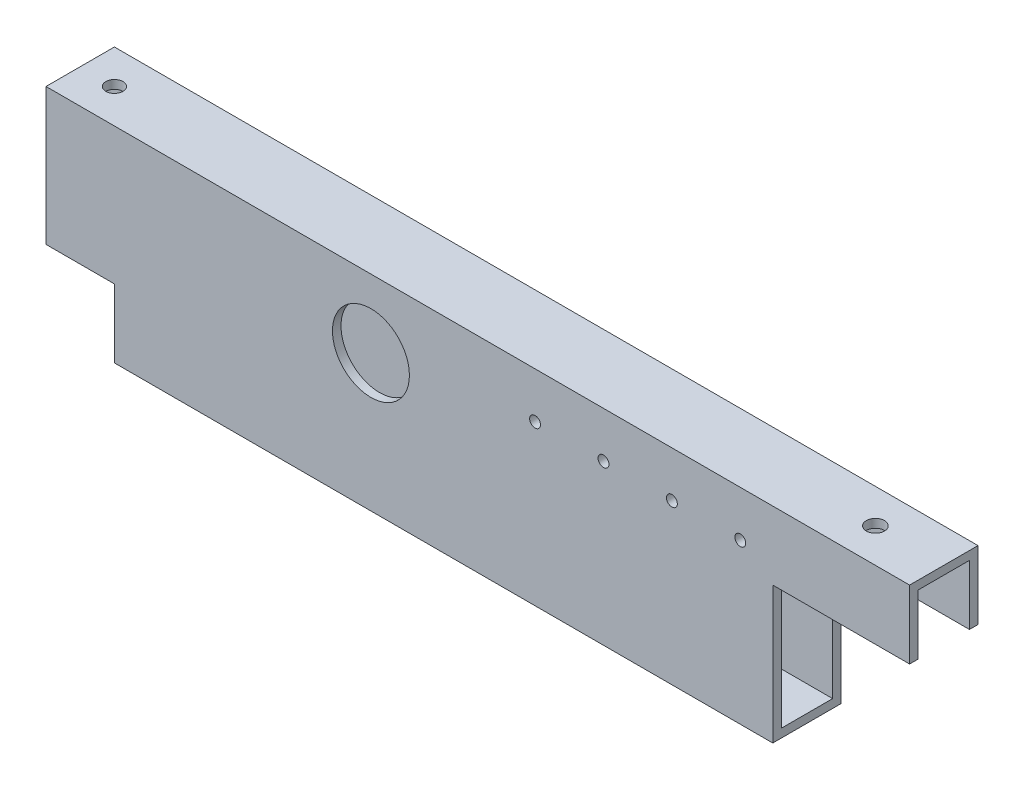
ISO-10303-21;
HEADER;
FILE_DESCRIPTION(('STEP AP214'),'2;1');
FILE_NAME('part.step','',(''),(''),'','','');
FILE_SCHEMA(('AUTOMOTIVE_DESIGN { 1 0 10303 214 1 1 1 1 }'));
ENDSEC;
DATA;
#1=APPLICATION_CONTEXT('core data for automotive mechanical design processes');
#2=APPLICATION_PROTOCOL_DEFINITION('international standard','automotive_design',2000,#1);
#3=PRODUCT_CONTEXT('',#1,'mechanical');
#4=PRODUCT('Part','Part','',(#3));
#5=PRODUCT_RELATED_PRODUCT_CATEGORY('part','',(#4));
#6=PRODUCT_DEFINITION_FORMATION('','',#4);
#7=PRODUCT_DEFINITION_CONTEXT('part definition',#1,'design');
#8=PRODUCT_DEFINITION('design','',#6,#7);
#9=PRODUCT_DEFINITION_SHAPE('','',#8);
#10=(LENGTH_UNIT() NAMED_UNIT(*) SI_UNIT(.MILLI.,.METRE.));
#11=(NAMED_UNIT(*) PLANE_ANGLE_UNIT() SI_UNIT($,.RADIAN.));
#12=(NAMED_UNIT(*) SI_UNIT($,.STERADIAN.) SOLID_ANGLE_UNIT());
#13=UNCERTAINTY_MEASURE_WITH_UNIT(LENGTH_MEASURE(1.E-05),#10,'distance_accuracy_value','');
#14=(GEOMETRIC_REPRESENTATION_CONTEXT(3) GLOBAL_UNCERTAINTY_ASSIGNED_CONTEXT((#13)) GLOBAL_UNIT_ASSIGNED_CONTEXT((#10,
#11,#12)) REPRESENTATION_CONTEXT('',''));
#15=CARTESIAN_POINT('',(0.,0.,0.));
#16=DIRECTION('',(0.,0.,1.));
#17=DIRECTION('',(1.,0.,0.));
#18=AXIS2_PLACEMENT_3D('',#15,#16,#17);
#19=CARTESIAN_POINT('',(0.,-12.7000000000001,12.7));
#20=DIRECTION('',(0.,1.,0.));
#21=DIRECTION('',(0.,0.,1.));
#22=AXIS2_PLACEMENT_3D('',#19,#20,#21);
#23=PLANE('',#22);
#24=DIRECTION('',(0.,0.,-1.));
#25=VECTOR('',#24,1.);
#26=CARTESIAN_POINT('',(-288.925,-12.7000000000001,12.7));
#27=LINE('',#26,#25);
#28=CARTESIAN_POINT('',(-288.925,-12.7000000000001,12.7));
#29=VERTEX_POINT('',#28);
#30=CARTESIAN_POINT('',(-288.925,-12.7,9.525));
#31=VERTEX_POINT('',#30);
#32=EDGE_CURVE('E293',#29,#31,#27,.T.);
#33=ORIENTED_EDGE('',*,*,#32,.T.);
#34=DIRECTION('',(1.,0.,0.));
#35=VECTOR('',#34,1.);
#36=CARTESIAN_POINT('',(0.,-12.7000000000001,9.525));
#37=LINE('',#36,#35);
#38=CARTESIAN_POINT('',(-263.525,-12.7000000000001,9.525));
#39=VERTEX_POINT('',#38);
#40=EDGE_CURVE('E255',#31,#39,#37,.T.);
#41=ORIENTED_EDGE('',*,*,#40,.T.);
#42=DIRECTION('',(0.,0.,-1.));
#43=VECTOR('',#42,1.);
#44=CARTESIAN_POINT('',(-263.525,-12.7000000000001,12.7));
#45=LINE('',#44,#43);
#46=CARTESIAN_POINT('',(-263.525,-12.7000000000001,12.7));
#47=VERTEX_POINT('',#46);
#48=EDGE_CURVE('E289',#47,#39,#45,.T.);
#49=ORIENTED_EDGE('',*,*,#48,.F.);
#50=DIRECTION('',(1.,0.,0.));
#51=VECTOR('',#50,1.);
#52=CARTESIAN_POINT('',(0.,-12.7000000000001,12.7));
#53=LINE('',#52,#51);
#54=EDGE_CURVE('E268',#29,#47,#53,.T.);
#55=ORIENTED_EDGE('',*,*,#54,.F.);
#56=EDGE_LOOP('',(#33,#41,#49,#55));
#57=FACE_BOUND('',#56,.T.);
#58=ADVANCED_FACE('F36',(#57),#23,.F.);
#59=CARTESIAN_POINT('',(0.,38.1,12.7));
#60=DIRECTION('',(0.,1.,0.));
#61=DIRECTION('',(0.,0.,1.));
#62=AXIS2_PLACEMENT_3D('',#59,#60,#61);
#63=PLANE('',#62);
#64=CARTESIAN_POINT('',(6.34999999999977,38.1,0.));
#65=DIRECTION('',(0.,1.,0.));
#66=DIRECTION('',(0.,0.,1.));
#67=AXIS2_PLACEMENT_3D('',#64,#65,#66);
#68=CIRCLE('',#67,3.3782);
#69=CARTESIAN_POINT('',(6.34999999999977,38.1,3.3782));
#70=VERTEX_POINT('',#69);
#71=EDGE_CURVE('E622',#70,#70,#68,.T.);
#72=ORIENTED_EDGE('',*,*,#71,.F.);
#73=EDGE_LOOP('',(#72));
#74=FACE_BOUND('',#73,.T.);
#75=DIRECTION('',(0.,0.,1.));
#76=VECTOR('',#75,1.);
#77=CARTESIAN_POINT('',(31.7499999999998,38.1,-12.7));
#78=LINE('',#77,#76);
#79=CARTESIAN_POINT('',(31.7499999999998,38.1,-12.7));
#80=VERTEX_POINT('',#79);
#81=CARTESIAN_POINT('',(31.7499999999998,38.1,12.7));
#82=VERTEX_POINT('',#81);
#83=EDGE_CURVE('E195',#80,#82,#78,.T.);
#84=ORIENTED_EDGE('',*,*,#83,.F.);
#85=DIRECTION('',(1.,0.,0.));
#86=VECTOR('',#85,1.);
#87=CARTESIAN_POINT('',(0.,38.1,-12.7));
#88=LINE('',#87,#86);
#89=CARTESIAN_POINT('',(-288.925,38.1,-12.7));
#90=VERTEX_POINT('',#89);
#91=EDGE_CURVE('E261',#90,#80,#88,.T.);
#92=ORIENTED_EDGE('',*,*,#91,.F.);
#93=DIRECTION('',(0.,0.,-1.));
#94=VECTOR('',#93,1.);
#95=CARTESIAN_POINT('',(-288.925,38.1,12.7));
#96=LINE('',#95,#94);
#97=CARTESIAN_POINT('',(-288.925,38.1,12.7));
#98=VERTEX_POINT('',#97);
#99=EDGE_CURVE('E296',#98,#90,#96,.T.);
#100=ORIENTED_EDGE('',*,*,#99,.F.);
#101=DIRECTION('',(1.,0.,0.));
#102=VECTOR('',#101,1.);
#103=CARTESIAN_POINT('',(0.,38.1,12.7));
#104=LINE('',#103,#102);
#105=EDGE_CURVE('E262',#98,#82,#104,.T.);
#106=ORIENTED_EDGE('',*,*,#105,.T.);
#107=EDGE_LOOP('',(#84,#92,#100,#106));
#108=FACE_BOUND('',#107,.T.);
#109=CARTESIAN_POINT('',(-276.225,38.1,0.));
#110=DIRECTION('',(0.,1.,0.));
#111=DIRECTION('',(0.,0.,1.));
#112=AXIS2_PLACEMENT_3D('',#109,#110,#111);
#113=CIRCLE('',#112,3.17499999999998);
#114=CARTESIAN_POINT('',(-276.225,38.1,3.17499999999998));
#115=VERTEX_POINT('',#114);
#116=EDGE_CURVE('E258',#115,#115,#113,.T.);
#117=ORIENTED_EDGE('',*,*,#116,.F.);
#118=EDGE_LOOP('',(#117));
#119=FACE_BOUND('',#118,.T.);
#120=ADVANCED_FACE('F38',(#74,#108,#119),#63,.T.);
#121=CARTESIAN_POINT('',(-288.925,0.,12.7));
#122=DIRECTION('',(1.,0.,0.));
#123=DIRECTION('',(0.,0.,-1.));
#124=AXIS2_PLACEMENT_3D('',#121,#122,#123);
#125=PLANE('',#124);
#126=DIRECTION('',(0.,0.,1.));
#127=VECTOR('',#126,1.);
#128=CARTESIAN_POINT('',(-288.925,34.925,-9.525));
#129=LINE('',#128,#127);
#130=CARTESIAN_POINT('',(-288.925,34.925,-9.525));
#131=VERTEX_POINT('',#130);
#132=CARTESIAN_POINT('',(-288.925,34.925,9.525));
#133=VERTEX_POINT('',#132);
#134=EDGE_CURVE('E233',#131,#133,#129,.T.);
#135=ORIENTED_EDGE('',*,*,#134,.T.);
#136=DIRECTION('',(0.,-1.,0.));
#137=VECTOR('',#136,1.);
#138=CARTESIAN_POINT('',(-288.925,34.925,9.525));
#139=LINE('',#138,#137);
#140=EDGE_CURVE('E236',#133,#31,#139,.T.);
#141=ORIENTED_EDGE('',*,*,#140,.T.);
#142=ORIENTED_EDGE('',*,*,#32,.F.);
#143=DIRECTION('',(0.,-1.,0.));
#144=VECTOR('',#143,1.);
#145=CARTESIAN_POINT('',(-288.925,0.,12.7));
#146=LINE('',#145,#144);
#147=EDGE_CURVE('E265',#98,#29,#146,.T.);
#148=ORIENTED_EDGE('',*,*,#147,.F.);
#149=ORIENTED_EDGE('',*,*,#99,.T.);
#150=DIRECTION('',(0.,-1.,0.));
#151=VECTOR('',#150,1.);
#152=CARTESIAN_POINT('',(-288.925,0.,-12.7));
#153=LINE('',#152,#151);
#154=CARTESIAN_POINT('',(-288.925,-12.7000000000001,-12.7));
#155=VERTEX_POINT('',#154);
#156=EDGE_CURVE('E277',#90,#155,#153,.T.);
#157=ORIENTED_EDGE('',*,*,#156,.T.);
#158=CARTESIAN_POINT('',(-288.925,-12.7000000000001,-9.525));
#159=VERTEX_POINT('',#158);
#160=EDGE_CURVE('E292',#159,#155,#27,.T.);
#161=ORIENTED_EDGE('',*,*,#160,.F.);
#162=DIRECTION('',(0.,1.,0.));
#163=VECTOR('',#162,1.);
#164=CARTESIAN_POINT('',(-288.925,-34.925,-9.525));
#165=LINE('',#164,#163);
#166=EDGE_CURVE('E230',#159,#131,#165,.T.);
#167=ORIENTED_EDGE('',*,*,#166,.T.);
#168=EDGE_LOOP('',(#135,#141,#142,#148,#149,#157,#161,#167));
#169=FACE_BOUND('',#168,.T.);
#170=ADVANCED_FACE('F344',(#169),#125,.F.);
#171=CARTESIAN_POINT('',(-263.525,-12.7000000000001,-9.525));
#172=VERTEX_POINT('',#171);
#173=CARTESIAN_POINT('',(-263.525,-12.7000000000001,-12.7));
#174=VERTEX_POINT('',#173);
#175=EDGE_CURVE('E288',#172,#174,#45,.T.);
#176=ORIENTED_EDGE('',*,*,#175,.F.);
#177=DIRECTION('',(-1.,0.,0.));
#178=VECTOR('',#177,1.);
#179=CARTESIAN_POINT('',(0.,-12.7000000000001,-9.525));
#180=LINE('',#179,#178);
#181=EDGE_CURVE('E252',#172,#159,#180,.T.);
#182=ORIENTED_EDGE('',*,*,#181,.T.);
#183=ORIENTED_EDGE('',*,*,#160,.T.);
#184=DIRECTION('',(1.,0.,0.));
#185=VECTOR('',#184,1.);
#186=CARTESIAN_POINT('',(0.,-12.7000000000001,-12.7));
#187=LINE('',#186,#185);
#188=EDGE_CURVE('E280',#155,#174,#187,.T.);
#189=ORIENTED_EDGE('',*,*,#188,.T.);
#190=EDGE_LOOP('',(#176,#182,#183,#189));
#191=FACE_BOUND('',#190,.T.);
#192=ADVANCED_FACE('F349',(#191),#23,.F.);
#193=CARTESIAN_POINT('',(-263.525,0.,12.7));
#194=DIRECTION('',(1.,0.,0.));
#195=DIRECTION('',(0.,0.,-1.));
#196=AXIS2_PLACEMENT_3D('',#193,#194,#195);
#197=PLANE('',#196);
#198=ORIENTED_EDGE('',*,*,#48,.T.);
#199=DIRECTION('',(0.,-1.,0.));
#200=VECTOR('',#199,1.);
#201=CARTESIAN_POINT('',(-263.525,0.,9.525));
#202=LINE('',#201,#200);
#203=CARTESIAN_POINT('',(-263.525,-34.925,9.525));
#204=VERTEX_POINT('',#203);
#205=EDGE_CURVE('E306',#39,#204,#202,.T.);
#206=ORIENTED_EDGE('',*,*,#205,.T.);
#207=DIRECTION('',(0.,0.,-1.));
#208=VECTOR('',#207,1.);
#209=CARTESIAN_POINT('',(-263.525,-34.925,12.7));
#210=LINE('',#209,#208);
#211=CARTESIAN_POINT('',(-263.525,-34.925,-9.525));
#212=VERTEX_POINT('',#211);
#213=EDGE_CURVE('E303',#204,#212,#210,.T.);
#214=ORIENTED_EDGE('',*,*,#213,.T.);
#215=DIRECTION('',(0.,1.,0.));
#216=VECTOR('',#215,1.);
#217=CARTESIAN_POINT('',(-263.525,0.,-9.525));
#218=LINE('',#217,#216);
#219=EDGE_CURVE('E298',#212,#172,#218,.T.);
#220=ORIENTED_EDGE('',*,*,#219,.T.);
#221=ORIENTED_EDGE('',*,*,#175,.T.);
#222=DIRECTION('',(0.,-1.,0.));
#223=VECTOR('',#222,1.);
#224=CARTESIAN_POINT('',(-263.525,0.,-12.7));
#225=LINE('',#224,#223);
#226=CARTESIAN_POINT('',(-263.525,-38.1000000000001,-12.7));
#227=VERTEX_POINT('',#226);
#228=EDGE_CURVE('E283',#174,#227,#225,.T.);
#229=ORIENTED_EDGE('',*,*,#228,.T.);
#230=DIRECTION('',(0.,0.,-1.));
#231=VECTOR('',#230,1.);
#232=CARTESIAN_POINT('',(-263.525,-38.1000000000001,12.7));
#233=LINE('',#232,#231);
#234=CARTESIAN_POINT('',(-263.525,-38.1000000000001,12.7));
#235=VERTEX_POINT('',#234);
#236=EDGE_CURVE('E275',#235,#227,#233,.T.);
#237=ORIENTED_EDGE('',*,*,#236,.F.);
#238=DIRECTION('',(0.,-1.,0.));
#239=VECTOR('',#238,1.);
#240=CARTESIAN_POINT('',(-263.525,0.,12.7));
#241=LINE('',#240,#239);
#242=EDGE_CURVE('E270',#47,#235,#241,.T.);
#243=ORIENTED_EDGE('',*,*,#242,.F.);
#244=EDGE_LOOP('',(#198,#206,#214,#220,#221,#229,#237,#243));
#245=FACE_BOUND('',#244,.T.);
#246=ADVANCED_FACE('F336',(#245),#197,.F.);
#247=CARTESIAN_POINT('',(0.,-38.1,12.7));
#248=DIRECTION('',(0.,1.,0.));
#249=DIRECTION('',(-1.,0.,0.));
#250=AXIS2_PLACEMENT_3D('',#247,#248,#249);
#251=PLANE('',#250);
#252=DIRECTION('',(1.,0.,0.));
#253=VECTOR('',#252,1.);
#254=CARTESIAN_POINT('',(0.,-38.1,-12.7));
#255=LINE('',#254,#253);
#256=CARTESIAN_POINT('',(-19.0500000000002,-38.1000000000001,-12.7));
#257=VERTEX_POINT('',#256);
#258=EDGE_CURVE('E266',#227,#257,#255,.T.);
#259=ORIENTED_EDGE('',*,*,#258,.T.);
#260=DIRECTION('',(0.,0.,1.));
#261=VECTOR('',#260,1.);
#262=CARTESIAN_POINT('',(-19.0500000000002,-38.1000000000001,-12.7));
#263=LINE('',#262,#261);
#264=CARTESIAN_POINT('',(-19.0500000000002,-38.1000000000001,12.7));
#265=VERTEX_POINT('',#264);
#266=EDGE_CURVE('E155',#257,#265,#263,.T.);
#267=ORIENTED_EDGE('',*,*,#266,.T.);
#268=DIRECTION('',(1.,0.,0.));
#269=VECTOR('',#268,1.);
#270=CARTESIAN_POINT('',(0.,-38.1,12.7));
#271=LINE('',#270,#269);
#272=EDGE_CURVE('E272',#235,#265,#271,.T.);
#273=ORIENTED_EDGE('',*,*,#272,.F.);
#274=ORIENTED_EDGE('',*,*,#236,.T.);
#275=EDGE_LOOP('',(#259,#267,#273,#274));
#276=FACE_BOUND('',#275,.T.);
#277=ADVANCED_FACE('F354',(#276),#251,.F.);
#278=CARTESIAN_POINT('',(0.,0.,12.7));
#279=DIRECTION('',(0.,0.,1.));
#280=DIRECTION('',(1.,0.,0.));
#281=AXIS2_PLACEMENT_3D('',#278,#279,#280);
#282=PLANE('',#281);
#283=DIRECTION('',(0.,-1.,0.));
#284=VECTOR('',#283,1.);
#285=CARTESIAN_POINT('',(-19.0500000000002,-38.1000000000001,12.7));
#286=LINE('',#285,#284);
#287=CARTESIAN_POINT('',(-19.0500000000002,12.6999999999999,12.7));
#288=VERTEX_POINT('',#287);
#289=EDGE_CURVE('E171',#288,#265,#286,.T.);
#290=ORIENTED_EDGE('',*,*,#289,.F.);
#291=DIRECTION('',(-1.,0.,0.));
#292=VECTOR('',#291,1.);
#293=CARTESIAN_POINT('',(31.7499999999998,12.7,12.7));
#294=LINE('',#293,#292);
#295=CARTESIAN_POINT('',(31.7499999999998,12.7,12.7));
#296=VERTEX_POINT('',#295);
#297=EDGE_CURVE('E173',#296,#288,#294,.T.);
#298=ORIENTED_EDGE('',*,*,#297,.F.);
#299=DIRECTION('',(0.,-1.,0.));
#300=VECTOR('',#299,1.);
#301=CARTESIAN_POINT('',(31.7499999999998,38.1,12.7));
#302=LINE('',#301,#300);
#303=EDGE_CURVE('E193',#82,#296,#302,.T.);
#304=ORIENTED_EDGE('',*,*,#303,.F.);
#305=ORIENTED_EDGE('',*,*,#105,.F.);
#306=ORIENTED_EDGE('',*,*,#147,.T.);
#307=ORIENTED_EDGE('',*,*,#54,.T.);
#308=ORIENTED_EDGE('',*,*,#242,.T.);
#309=ORIENTED_EDGE('',*,*,#272,.T.);
#310=EDGE_LOOP('',(#290,#298,#304,#305,#306,#307,#308,#309));
#311=FACE_BOUND('',#310,.T.);
#312=CARTESIAN_POINT('',(-107.315,21.082,12.7));
#313=DIRECTION('',(0.,0.,1.));
#314=DIRECTION('',(1.,0.,0.));
#315=AXIS2_PLACEMENT_3D('',#312,#313,#314);
#316=CIRCLE('',#315,2.01929999999999);
#317=CARTESIAN_POINT('',(-105.2957,21.082,12.7));
#318=VERTEX_POINT('',#317);
#319=EDGE_CURVE('E202',#318,#318,#316,.T.);
#320=ORIENTED_EDGE('',*,*,#319,.F.);
#321=EDGE_LOOP('',(#320));
#322=FACE_BOUND('',#321,.T.);
#323=CARTESIAN_POINT('',(-81.9150000000002,21.082,12.7));
#324=DIRECTION('',(0.,0.,1.));
#325=DIRECTION('',(1.,0.,0.));
#326=AXIS2_PLACEMENT_3D('',#323,#324,#325);
#327=CIRCLE('',#326,2.01929999999999);
#328=CARTESIAN_POINT('',(-79.8957000000002,21.082,12.7));
#329=VERTEX_POINT('',#328);
#330=EDGE_CURVE('E206',#329,#329,#327,.T.);
#331=ORIENTED_EDGE('',*,*,#330,.F.);
#332=EDGE_LOOP('',(#331));
#333=FACE_BOUND('',#332,.T.);
#334=CARTESIAN_POINT('',(-56.5150000000002,21.082,12.7));
#335=DIRECTION('',(0.,0.,1.));
#336=DIRECTION('',(1.,0.,0.));
#337=AXIS2_PLACEMENT_3D('',#334,#335,#336);
#338=CIRCLE('',#337,2.01929999999999);
#339=CARTESIAN_POINT('',(-54.4957000000002,21.082,12.7));
#340=VERTEX_POINT('',#339);
#341=EDGE_CURVE('E212',#340,#340,#338,.T.);
#342=ORIENTED_EDGE('',*,*,#341,.F.);
#343=EDGE_LOOP('',(#342));
#344=FACE_BOUND('',#343,.T.);
#345=CARTESIAN_POINT('',(-31.1150000000002,21.082,12.7));
#346=DIRECTION('',(0.,0.,1.));
#347=DIRECTION('',(1.,0.,0.));
#348=AXIS2_PLACEMENT_3D('',#345,#346,#347);
#349=CIRCLE('',#348,2.01929999999999);
#350=CARTESIAN_POINT('',(-29.0957000000003,21.082,12.7));
#351=VERTEX_POINT('',#350);
#352=EDGE_CURVE('E216',#351,#351,#349,.T.);
#353=ORIENTED_EDGE('',*,*,#352,.F.);
#354=EDGE_LOOP('',(#353));
#355=FACE_BOUND('',#354,.T.);
#356=CARTESIAN_POINT('',(-168.275,12.7,12.7));
#357=DIRECTION('',(0.,0.,1.));
#358=DIRECTION('',(1.,0.,0.));
#359=AXIS2_PLACEMENT_3D('',#356,#357,#358);
#360=CIRCLE('',#359,14.2875);
#361=CARTESIAN_POINT('',(-153.9875,12.7,12.7));
#362=VERTEX_POINT('',#361);
#363=EDGE_CURVE('E224',#362,#362,#360,.T.);
#364=ORIENTED_EDGE('',*,*,#363,.F.);
#365=EDGE_LOOP('',(#364));
#366=FACE_BOUND('',#365,.T.);
#367=ADVANCED_FACE('F357',(#311,#322,#333,#344,#355,#366),#282,.T.);
#368=CARTESIAN_POINT('',(0.,0.,-12.7));
#369=DIRECTION('',(0.,0.,1.));
#370=DIRECTION('',(1.,0.,0.));
#371=AXIS2_PLACEMENT_3D('',#368,#369,#370);
#372=PLANE('',#371);
#373=CARTESIAN_POINT('',(-168.275,12.7,-12.7));
#374=DIRECTION('',(0.,0.,1.));
#375=DIRECTION('',(1.,0.,0.));
#376=AXIS2_PLACEMENT_3D('',#373,#374,#375);
#377=CIRCLE('',#376,14.2875);
#378=CARTESIAN_POINT('',(-153.9875,12.7,-12.7));
#379=VERTEX_POINT('',#378);
#380=EDGE_CURVE('E220',#379,#379,#377,.T.);
#381=ORIENTED_EDGE('',*,*,#380,.T.);
#382=EDGE_LOOP('',(#381));
#383=FACE_BOUND('',#382,.T.);
#384=DIRECTION('',(-1.,0.,0.));
#385=VECTOR('',#384,1.);
#386=CARTESIAN_POINT('',(31.7499999999998,12.7,-12.7));
#387=LINE('',#386,#385);
#388=CARTESIAN_POINT('',(31.7499999999998,12.7,-12.7));
#389=VERTEX_POINT('',#388);
#390=CARTESIAN_POINT('',(-19.0500000000002,12.6999999999999,-12.7));
#391=VERTEX_POINT('',#390);
#392=EDGE_CURVE('E51',#389,#391,#387,.T.);
#393=ORIENTED_EDGE('',*,*,#392,.T.);
#394=DIRECTION('',(0.,-1.,0.));
#395=VECTOR('',#394,1.);
#396=CARTESIAN_POINT('',(-19.0500000000002,-38.1000000000001,-12.7));
#397=LINE('',#396,#395);
#398=EDGE_CURVE('E159',#391,#257,#397,.T.);
#399=ORIENTED_EDGE('',*,*,#398,.T.);
#400=ORIENTED_EDGE('',*,*,#258,.F.);
#401=ORIENTED_EDGE('',*,*,#228,.F.);
#402=ORIENTED_EDGE('',*,*,#188,.F.);
#403=ORIENTED_EDGE('',*,*,#156,.F.);
#404=ORIENTED_EDGE('',*,*,#91,.T.);
#405=DIRECTION('',(0.,-1.,0.));
#406=VECTOR('',#405,1.);
#407=CARTESIAN_POINT('',(31.7499999999998,38.1,-12.7));
#408=LINE('',#407,#406);
#409=EDGE_CURVE('E170',#80,#389,#408,.T.);
#410=ORIENTED_EDGE('',*,*,#409,.T.);
#411=EDGE_LOOP('',(#393,#399,#400,#401,#402,#403,#404,#410));
#412=FACE_BOUND('',#411,.T.);
#413=ADVANCED_FACE('F168',(#383,#412),#372,.F.);
#414=CARTESIAN_POINT('',(-276.225,38.1,0.));
#415=DIRECTION('',(0.,1.,0.));
#416=DIRECTION('',(0.,0.,1.));
#417=AXIS2_PLACEMENT_3D('',#414,#415,#416);
#418=CYLINDRICAL_SURFACE('',#417,3.17499999999998);
#419=CARTESIAN_POINT('',(-276.225,34.925,0.));
#420=DIRECTION('',(0.,1.,0.));
#421=DIRECTION('',(0.,0.,1.));
#422=AXIS2_PLACEMENT_3D('',#419,#420,#421);
#423=CIRCLE('',#422,3.17499999999998);
#424=CARTESIAN_POINT('',(-276.225,34.925,3.17499999999998));
#425=VERTEX_POINT('',#424);
#426=EDGE_CURVE('E243',#425,#425,#423,.F.);
#427=ORIENTED_EDGE('',*,*,#426,.T.);
#428=EDGE_LOOP('',(#427));
#429=FACE_BOUND('',#428,.T.);
#430=ORIENTED_EDGE('',*,*,#116,.T.);
#431=EDGE_LOOP('',(#430));
#432=FACE_BOUND('',#431,.T.);
#433=ADVANCED_FACE('F523',(#429,#432),#418,.F.);
#434=CARTESIAN_POINT('',(-288.925,-34.925,9.525));
#435=DIRECTION('',(0.,-1.,0.));
#436=DIRECTION('',(0.,0.,-1.));
#437=AXIS2_PLACEMENT_3D('',#434,#435,#436);
#438=PLANE('',#437);
#439=DIRECTION('',(1.,0.,0.));
#440=VECTOR('',#439,1.);
#441=CARTESIAN_POINT('',(-288.925,-34.925,9.525));
#442=LINE('',#441,#440);
#443=CARTESIAN_POINT('',(-19.0500000000002,-34.925,9.525));
#444=VERTEX_POINT('',#443);
#445=EDGE_CURVE('E244',#204,#444,#442,.T.);
#446=ORIENTED_EDGE('',*,*,#445,.T.);
#447=DIRECTION('',(0.,0.,-1.));
#448=VECTOR('',#447,1.);
#449=CARTESIAN_POINT('',(-19.0500000000002,-34.925,9.525));
#450=LINE('',#449,#448);
#451=CARTESIAN_POINT('',(-19.0500000000002,-34.925,-9.525));
#452=VERTEX_POINT('',#451);
#453=EDGE_CURVE('E187',#444,#452,#450,.T.);
#454=ORIENTED_EDGE('',*,*,#453,.T.);
#455=DIRECTION('',(1.,0.,0.));
#456=VECTOR('',#455,1.);
#457=CARTESIAN_POINT('',(-288.925,-34.925,-9.525));
#458=LINE('',#457,#456);
#459=EDGE_CURVE('E240',#212,#452,#458,.T.);
#460=ORIENTED_EDGE('',*,*,#459,.F.);
#461=ORIENTED_EDGE('',*,*,#213,.F.);
#462=EDGE_LOOP('',(#446,#454,#460,#461));
#463=FACE_BOUND('',#462,.T.);
#464=ADVANCED_FACE('F333',(#463),#438,.F.);
#465=CARTESIAN_POINT('',(-288.925,-12.7000000000001,9.525));
#466=DIRECTION('',(0.,0.,1.));
#467=DIRECTION('',(1.,0.,0.));
#468=AXIS2_PLACEMENT_3D('',#465,#466,#467);
#469=PLANE('',#468);
#470=CARTESIAN_POINT('',(-107.315,21.082,9.525));
#471=DIRECTION('',(0.,0.,1.));
#472=DIRECTION('',(1.,0.,0.));
#473=AXIS2_PLACEMENT_3D('',#470,#471,#472);
#474=CIRCLE('',#473,2.01929999999999);
#475=CARTESIAN_POINT('',(-105.2957,21.082,9.525));
#476=VERTEX_POINT('',#475);
#477=EDGE_CURVE('E205',#476,#476,#474,.T.);
#478=ORIENTED_EDGE('',*,*,#477,.T.);
#479=EDGE_LOOP('',(#478));
#480=FACE_BOUND('',#479,.T.);
#481=CARTESIAN_POINT('',(-81.9150000000002,21.082,9.525));
#482=DIRECTION('',(0.,0.,1.));
#483=DIRECTION('',(1.,0.,0.));
#484=AXIS2_PLACEMENT_3D('',#481,#482,#483);
#485=CIRCLE('',#484,2.01929999999999);
#486=CARTESIAN_POINT('',(-79.8957000000002,21.082,9.525));
#487=VERTEX_POINT('',#486);
#488=EDGE_CURVE('E209',#487,#487,#485,.T.);
#489=ORIENTED_EDGE('',*,*,#488,.T.);
#490=EDGE_LOOP('',(#489));
#491=FACE_BOUND('',#490,.T.);
#492=CARTESIAN_POINT('',(-56.5150000000002,21.082,9.525));
#493=DIRECTION('',(0.,0.,1.));
#494=DIRECTION('',(1.,0.,0.));
#495=AXIS2_PLACEMENT_3D('',#492,#493,#494);
#496=CIRCLE('',#495,2.01929999999999);
#497=CARTESIAN_POINT('',(-54.4957000000002,21.082,9.525));
#498=VERTEX_POINT('',#497);
#499=EDGE_CURVE('E215',#498,#498,#496,.T.);
#500=ORIENTED_EDGE('',*,*,#499,.T.);
#501=EDGE_LOOP('',(#500));
#502=FACE_BOUND('',#501,.T.);
#503=CARTESIAN_POINT('',(-31.1150000000002,21.082,9.525));
#504=DIRECTION('',(0.,0.,1.));
#505=DIRECTION('',(1.,0.,0.));
#506=AXIS2_PLACEMENT_3D('',#503,#504,#505);
#507=CIRCLE('',#506,2.01929999999999);
#508=CARTESIAN_POINT('',(-29.0957000000003,21.082,9.525));
#509=VERTEX_POINT('',#508);
#510=EDGE_CURVE('E219',#509,#509,#507,.T.);
#511=ORIENTED_EDGE('',*,*,#510,.T.);
#512=EDGE_LOOP('',(#511));
#513=FACE_BOUND('',#512,.T.);
#514=CARTESIAN_POINT('',(-168.275,12.7,9.525));
#515=DIRECTION('',(0.,0.,1.));
#516=DIRECTION('',(1.,0.,0.));
#517=AXIS2_PLACEMENT_3D('',#514,#515,#516);
#518=CIRCLE('',#517,14.2875);
#519=CARTESIAN_POINT('',(-153.9875,12.7,9.525));
#520=VERTEX_POINT('',#519);
#521=EDGE_CURVE('E227',#520,#520,#518,.T.);
#522=ORIENTED_EDGE('',*,*,#521,.T.);
#523=EDGE_LOOP('',(#522));
#524=FACE_BOUND('',#523,.T.);
#525=DIRECTION('',(-1.,0.,0.));
#526=VECTOR('',#525,1.);
#527=CARTESIAN_POINT('',(-288.925,12.6999999999999,9.525));
#528=LINE('',#527,#526);
#529=CARTESIAN_POINT('',(31.7499999999998,12.7,9.525));
#530=VERTEX_POINT('',#529);
#531=CARTESIAN_POINT('',(-19.0500000000002,12.6999999999999,9.525));
#532=VERTEX_POINT('',#531);
#533=EDGE_CURVE('E184',#530,#532,#528,.T.);
#534=ORIENTED_EDGE('',*,*,#533,.T.);
#535=DIRECTION('',(0.,-1.,0.));
#536=VECTOR('',#535,1.);
#537=CARTESIAN_POINT('',(-19.0500000000002,-12.7000000000001,9.525));
#538=LINE('',#537,#536);
#539=EDGE_CURVE('E190',#532,#444,#538,.T.);
#540=ORIENTED_EDGE('',*,*,#539,.T.);
#541=ORIENTED_EDGE('',*,*,#445,.F.);
#542=ORIENTED_EDGE('',*,*,#205,.F.);
#543=ORIENTED_EDGE('',*,*,#40,.F.);
#544=ORIENTED_EDGE('',*,*,#140,.F.);
#545=DIRECTION('',(1.,0.,0.));
#546=VECTOR('',#545,1.);
#547=CARTESIAN_POINT('',(-288.925,34.925,9.525));
#548=LINE('',#547,#546);
#549=CARTESIAN_POINT('',(31.7499999999998,34.925,9.525));
#550=VERTEX_POINT('',#549);
#551=EDGE_CURVE('E247',#133,#550,#548,.T.);
#552=ORIENTED_EDGE('',*,*,#551,.T.);
#553=DIRECTION('',(0.,-1.,0.));
#554=VECTOR('',#553,1.);
#555=CARTESIAN_POINT('',(31.7499999999998,-12.7000000000001,9.525));
#556=LINE('',#555,#554);
#557=EDGE_CURVE('E59',#550,#530,#556,.T.);
#558=ORIENTED_EDGE('',*,*,#557,.T.);
#559=EDGE_LOOP('',(#534,#540,#541,#542,#543,#544,#552,#558));
#560=FACE_BOUND('',#559,.T.);
#561=ADVANCED_FACE('F323',(#480,#491,#502,#513,#524,#560),#469,.F.);
#562=CARTESIAN_POINT('',(-288.925,-12.7000000000001,-9.525));
#563=DIRECTION('',(0.,0.,-1.));
#564=DIRECTION('',(-1.,0.,0.));
#565=AXIS2_PLACEMENT_3D('',#562,#563,#564);
#566=PLANE('',#565);
#567=CARTESIAN_POINT('',(-168.275,12.7,-9.525));
#568=DIRECTION('',(0.,0.,-1.));
#569=DIRECTION('',(-1.,0.,0.));
#570=AXIS2_PLACEMENT_3D('',#567,#568,#569);
#571=CIRCLE('',#570,14.2875);
#572=CARTESIAN_POINT('',(-182.5625,12.7,-9.525));
#573=VERTEX_POINT('',#572);
#574=EDGE_CURVE('E223',#573,#573,#571,.T.);
#575=ORIENTED_EDGE('',*,*,#574,.T.);
#576=EDGE_LOOP('',(#575));
#577=FACE_BOUND('',#576,.T.);
#578=ORIENTED_EDGE('',*,*,#459,.T.);
#579=DIRECTION('',(0.,1.,0.));
#580=VECTOR('',#579,1.);
#581=CARTESIAN_POINT('',(-19.0500000000002,-12.7000000000001,-9.525));
#582=LINE('',#581,#580);
#583=CARTESIAN_POINT('',(-19.0500000000002,12.6999999999999,-9.525));
#584=VERTEX_POINT('',#583);
#585=EDGE_CURVE('E11',#452,#584,#582,.T.);
#586=ORIENTED_EDGE('',*,*,#585,.T.);
#587=DIRECTION('',(1.,0.,0.));
#588=VECTOR('',#587,1.);
#589=CARTESIAN_POINT('',(-288.925,12.6999999999999,-9.525));
#590=LINE('',#589,#588);
#591=CARTESIAN_POINT('',(31.7499999999998,12.7,-9.525));
#592=VERTEX_POINT('',#591);
#593=EDGE_CURVE('E153',#584,#592,#590,.T.);
#594=ORIENTED_EDGE('',*,*,#593,.T.);
#595=DIRECTION('',(0.,1.,0.));
#596=VECTOR('',#595,1.);
#597=CARTESIAN_POINT('',(31.7499999999998,-12.7000000000001,-9.525));
#598=LINE('',#597,#596);
#599=CARTESIAN_POINT('',(31.7499999999998,34.925,-9.525));
#600=VERTEX_POINT('',#599);
#601=EDGE_CURVE('E199',#592,#600,#598,.T.);
#602=ORIENTED_EDGE('',*,*,#601,.T.);
#603=DIRECTION('',(1.,0.,0.));
#604=VECTOR('',#603,1.);
#605=CARTESIAN_POINT('',(-288.925,34.925,-9.525));
#606=LINE('',#605,#604);
#607=EDGE_CURVE('E239',#131,#600,#606,.T.);
#608=ORIENTED_EDGE('',*,*,#607,.F.);
#609=ORIENTED_EDGE('',*,*,#166,.F.);
#610=ORIENTED_EDGE('',*,*,#181,.F.);
#611=ORIENTED_EDGE('',*,*,#219,.F.);
#612=EDGE_LOOP('',(#578,#586,#594,#602,#608,#609,#610,#611));
#613=FACE_BOUND('',#612,.T.);
#614=ADVANCED_FACE('F330',(#577,#613),#566,.F.);
#615=CARTESIAN_POINT('',(-288.925,34.925,-9.525));
#616=DIRECTION('',(0.,1.,0.));
#617=DIRECTION('',(0.,0.,1.));
#618=AXIS2_PLACEMENT_3D('',#615,#616,#617);
#619=PLANE('',#618);
#620=CARTESIAN_POINT('',(6.34999999999977,34.925,0.));
#621=DIRECTION('',(0.,1.,0.));
#622=DIRECTION('',(0.,0.,1.));
#623=AXIS2_PLACEMENT_3D('',#620,#621,#622);
#624=CIRCLE('',#623,3.3782);
#625=CARTESIAN_POINT('',(6.34999999999977,34.925,3.3782));
#626=VERTEX_POINT('',#625);
#627=EDGE_CURVE('E176',#626,#626,#624,.T.);
#628=ORIENTED_EDGE('',*,*,#627,.T.);
#629=EDGE_LOOP('',(#628));
#630=FACE_BOUND('',#629,.T.);
#631=ORIENTED_EDGE('',*,*,#426,.F.);
#632=EDGE_LOOP('',(#631));
#633=FACE_BOUND('',#632,.T.);
#634=ORIENTED_EDGE('',*,*,#607,.T.);
#635=DIRECTION('',(0.,0.,1.));
#636=VECTOR('',#635,1.);
#637=CARTESIAN_POINT('',(31.7499999999998,34.925,-9.525));
#638=LINE('',#637,#636);
#639=EDGE_CURVE('E309',#600,#550,#638,.T.);
#640=ORIENTED_EDGE('',*,*,#639,.T.);
#641=ORIENTED_EDGE('',*,*,#551,.F.);
#642=ORIENTED_EDGE('',*,*,#134,.F.);
#643=EDGE_LOOP('',(#634,#640,#641,#642));
#644=FACE_BOUND('',#643,.T.);
#645=ADVANCED_FACE('F327',(#630,#633,#644),#619,.F.);
#646=CARTESIAN_POINT('',(-168.275,12.7,-12.7));
#647=DIRECTION('',(0.,0.,1.));
#648=DIRECTION('',(1.,0.,0.));
#649=AXIS2_PLACEMENT_3D('',#646,#647,#648);
#650=CYLINDRICAL_SURFACE('',#649,14.2875);
#651=ORIENTED_EDGE('',*,*,#380,.F.);
#652=EDGE_LOOP('',(#651));
#653=FACE_BOUND('',#652,.T.);
#654=ORIENTED_EDGE('',*,*,#574,.F.);
#655=EDGE_LOOP('',(#654));
#656=FACE_BOUND('',#655,.T.);
#657=ADVANCED_FACE('F405',(#653,#656),#650,.F.);
#658=ORIENTED_EDGE('',*,*,#363,.T.);
#659=EDGE_LOOP('',(#658));
#660=FACE_BOUND('',#659,.T.);
#661=ORIENTED_EDGE('',*,*,#521,.F.);
#662=EDGE_LOOP('',(#661));
#663=FACE_BOUND('',#662,.T.);
#664=ADVANCED_FACE('F477',(#660,#663),#650,.F.);
#665=CARTESIAN_POINT('',(-31.1150000000002,21.082,12.7));
#666=DIRECTION('',(0.,0.,1.));
#667=DIRECTION('',(1.,0.,0.));
#668=AXIS2_PLACEMENT_3D('',#665,#666,#667);
#669=CYLINDRICAL_SURFACE('',#668,2.01929999999999);
#670=ORIENTED_EDGE('',*,*,#352,.T.);
#671=EDGE_LOOP('',(#670));
#672=FACE_BOUND('',#671,.T.);
#673=ORIENTED_EDGE('',*,*,#510,.F.);
#674=EDGE_LOOP('',(#673));
#675=FACE_BOUND('',#674,.T.);
#676=ADVANCED_FACE('F467',(#672,#675),#669,.F.);
#677=CARTESIAN_POINT('',(-56.5150000000002,21.082,12.7));
#678=DIRECTION('',(0.,0.,1.));
#679=DIRECTION('',(1.,0.,0.));
#680=AXIS2_PLACEMENT_3D('',#677,#678,#679);
#681=CYLINDRICAL_SURFACE('',#680,2.01929999999999);
#682=ORIENTED_EDGE('',*,*,#341,.T.);
#683=EDGE_LOOP('',(#682));
#684=FACE_BOUND('',#683,.T.);
#685=ORIENTED_EDGE('',*,*,#499,.F.);
#686=EDGE_LOOP('',(#685));
#687=FACE_BOUND('',#686,.T.);
#688=ADVANCED_FACE('F457',(#684,#687),#681,.F.);
#689=CARTESIAN_POINT('',(-81.9150000000002,21.082,12.7));
#690=DIRECTION('',(0.,0.,1.));
#691=DIRECTION('',(1.,0.,0.));
#692=AXIS2_PLACEMENT_3D('',#689,#690,#691);
#693=CYLINDRICAL_SURFACE('',#692,2.01929999999999);
#694=ORIENTED_EDGE('',*,*,#330,.T.);
#695=EDGE_LOOP('',(#694));
#696=FACE_BOUND('',#695,.T.);
#697=ORIENTED_EDGE('',*,*,#488,.F.);
#698=EDGE_LOOP('',(#697));
#699=FACE_BOUND('',#698,.T.);
#700=ADVANCED_FACE('F446',(#696,#699),#693,.F.);
#701=CARTESIAN_POINT('',(-107.315,21.082,12.7));
#702=DIRECTION('',(0.,0.,1.));
#703=DIRECTION('',(1.,0.,0.));
#704=AXIS2_PLACEMENT_3D('',#701,#702,#703);
#705=CYLINDRICAL_SURFACE('',#704,2.01929999999999);
#706=ORIENTED_EDGE('',*,*,#319,.T.);
#707=EDGE_LOOP('',(#706));
#708=FACE_BOUND('',#707,.T.);
#709=ORIENTED_EDGE('',*,*,#477,.F.);
#710=EDGE_LOOP('',(#709));
#711=FACE_BOUND('',#710,.T.);
#712=ADVANCED_FACE('F438',(#708,#711),#705,.F.);
#713=CARTESIAN_POINT('',(31.7499999999998,38.1,-12.7));
#714=DIRECTION('',(-1.,0.,0.));
#715=DIRECTION('',(0.,0.,1.));
#716=AXIS2_PLACEMENT_3D('',#713,#714,#715);
#717=PLANE('',#716);
#718=ORIENTED_EDGE('',*,*,#303,.T.);
#719=DIRECTION('',(0.,0.,-1.));
#720=VECTOR('',#719,1.);
#721=CARTESIAN_POINT('',(31.7499999999998,12.7,-12.7));
#722=LINE('',#721,#720);
#723=EDGE_CURVE('E44',#296,#530,#722,.T.);
#724=ORIENTED_EDGE('',*,*,#723,.T.);
#725=ORIENTED_EDGE('',*,*,#557,.F.);
#726=ORIENTED_EDGE('',*,*,#639,.F.);
#727=ORIENTED_EDGE('',*,*,#601,.F.);
#728=DIRECTION('',(0.,0.,1.));
#729=VECTOR('',#728,1.);
#730=CARTESIAN_POINT('',(31.7499999999998,12.7,-12.7));
#731=LINE('',#730,#729);
#732=EDGE_CURVE('E165',#389,#592,#731,.T.);
#733=ORIENTED_EDGE('',*,*,#732,.F.);
#734=ORIENTED_EDGE('',*,*,#409,.F.);
#735=ORIENTED_EDGE('',*,*,#83,.T.);
#736=EDGE_LOOP('',(#718,#724,#725,#726,#727,#733,#734,#735));
#737=FACE_BOUND('',#736,.T.);
#738=ADVANCED_FACE('F318',(#737),#717,.F.);
#739=CARTESIAN_POINT('',(-19.0500000000002,-38.1000000000001,-12.7));
#740=DIRECTION('',(-1.,0.,0.));
#741=DIRECTION('',(0.,0.,1.));
#742=AXIS2_PLACEMENT_3D('',#739,#740,#741);
#743=PLANE('',#742);
#744=DIRECTION('',(0.,0.,1.));
#745=VECTOR('',#744,1.);
#746=CARTESIAN_POINT('',(-19.0500000000002,12.6999999999999,-12.7));
#747=LINE('',#746,#745);
#748=EDGE_CURVE('E156',#532,#288,#747,.T.);
#749=ORIENTED_EDGE('',*,*,#748,.T.);
#750=ORIENTED_EDGE('',*,*,#289,.T.);
#751=ORIENTED_EDGE('',*,*,#266,.F.);
#752=ORIENTED_EDGE('',*,*,#398,.F.);
#753=EDGE_CURVE('E149',#391,#584,#747,.T.);
#754=ORIENTED_EDGE('',*,*,#753,.T.);
#755=ORIENTED_EDGE('',*,*,#585,.F.);
#756=ORIENTED_EDGE('',*,*,#453,.F.);
#757=ORIENTED_EDGE('',*,*,#539,.F.);
#758=EDGE_LOOP('',(#749,#750,#751,#752,#754,#755,#756,#757));
#759=FACE_BOUND('',#758,.T.);
#760=ADVANCED_FACE('F160',(#759),#743,.F.);
#761=CARTESIAN_POINT('',(31.7499999999998,12.7,-12.7));
#762=DIRECTION('',(0.,1.,0.));
#763=DIRECTION('',(-1.,0.,0.));
#764=AXIS2_PLACEMENT_3D('',#761,#762,#763);
#765=PLANE('',#764);
#766=ORIENTED_EDGE('',*,*,#723,.F.);
#767=ORIENTED_EDGE('',*,*,#297,.T.);
#768=ORIENTED_EDGE('',*,*,#748,.F.);
#769=ORIENTED_EDGE('',*,*,#533,.F.);
#770=EDGE_LOOP('',(#766,#767,#768,#769));
#771=FACE_BOUND('',#770,.T.);
#772=ADVANCED_FACE('F366',(#771),#765,.F.);
#773=ORIENTED_EDGE('',*,*,#753,.F.);
#774=ORIENTED_EDGE('',*,*,#392,.F.);
#775=ORIENTED_EDGE('',*,*,#732,.T.);
#776=ORIENTED_EDGE('',*,*,#593,.F.);
#777=EDGE_LOOP('',(#773,#774,#775,#776));
#778=FACE_BOUND('',#777,.T.);
#779=ADVANCED_FACE('F151',(#778),#765,.F.);
#780=CARTESIAN_POINT('',(6.34999999999977,38.1,0.));
#781=DIRECTION('',(0.,1.,0.));
#782=DIRECTION('',(0.,0.,1.));
#783=AXIS2_PLACEMENT_3D('',#780,#781,#782);
#784=CYLINDRICAL_SURFACE('',#783,3.3782);
#785=ORIENTED_EDGE('',*,*,#71,.T.);
#786=EDGE_LOOP('',(#785));
#787=FACE_BOUND('',#786,.T.);
#788=ORIENTED_EDGE('',*,*,#627,.F.);
#789=EDGE_LOOP('',(#788));
#790=FACE_BOUND('',#789,.T.);
#791=ADVANCED_FACE('F373',(#787,#790),#784,.F.);
#792=CLOSED_SHELL('',(#58,#120,#170,#192,#246,#277,#367,#413,#433,#464,#561,#614,#645,#657,#664,
#676,#688,#700,#712,#738,#760,#772,#779,#791));
#793=MANIFOLD_SOLID_BREP('B2',#792);
#794=ADVANCED_BREP_SHAPE_REPRESENTATION('',(#18,#793),#14);
#795=SHAPE_DEFINITION_REPRESENTATION(#9,#794);
ENDSEC;
END-ISO-10303-21;
